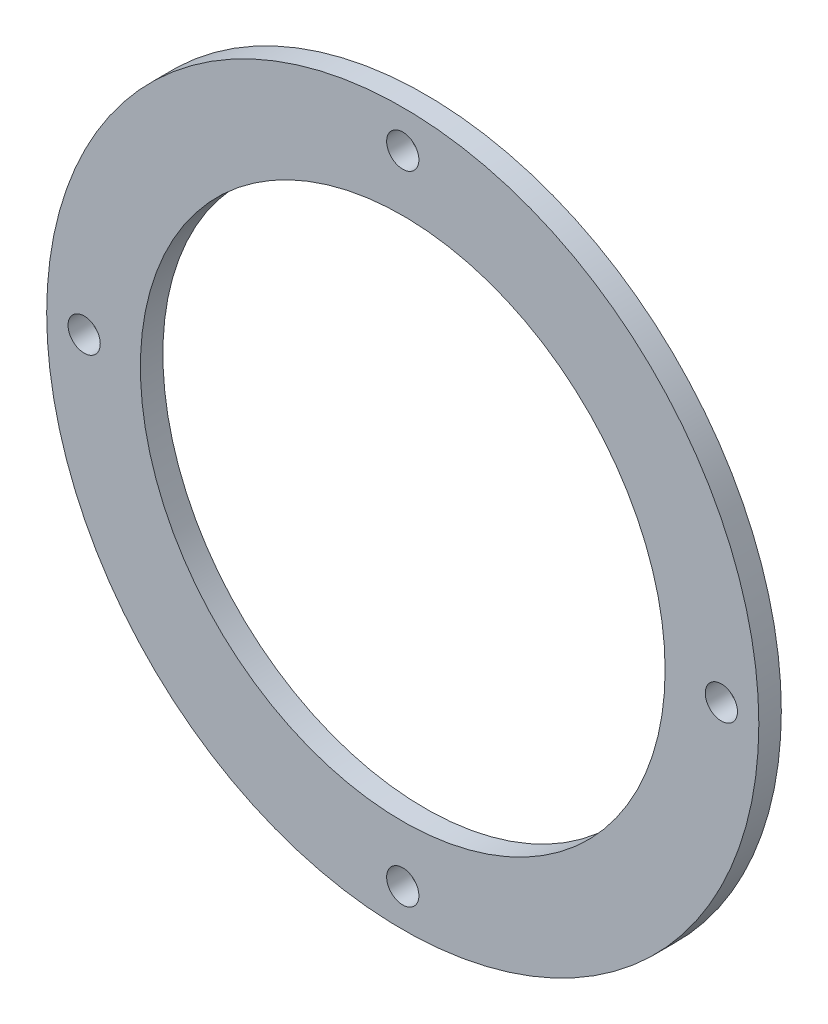
ISO-10303-21;
HEADER;
FILE_DESCRIPTION(('STEP AP214'),'2;1');
FILE_NAME('part.step','',(''),(''),'','','');
FILE_SCHEMA(('AUTOMOTIVE_DESIGN { 1 0 10303 214 1 1 1 1 }'));
ENDSEC;
DATA;
#1=APPLICATION_CONTEXT('core data for automotive mechanical design processes');
#2=APPLICATION_PROTOCOL_DEFINITION('international standard','automotive_design',2000,#1);
#3=PRODUCT_CONTEXT('',#1,'mechanical');
#4=PRODUCT('Part','Part','',(#3));
#5=PRODUCT_RELATED_PRODUCT_CATEGORY('part','',(#4));
#6=PRODUCT_DEFINITION_FORMATION('','',#4);
#7=PRODUCT_DEFINITION_CONTEXT('part definition',#1,'design');
#8=PRODUCT_DEFINITION('design','',#6,#7);
#9=PRODUCT_DEFINITION_SHAPE('','',#8);
#10=(LENGTH_UNIT() NAMED_UNIT(*) SI_UNIT(.MILLI.,.METRE.));
#11=(NAMED_UNIT(*) PLANE_ANGLE_UNIT() SI_UNIT($,.RADIAN.));
#12=(NAMED_UNIT(*) SI_UNIT($,.STERADIAN.) SOLID_ANGLE_UNIT());
#13=UNCERTAINTY_MEASURE_WITH_UNIT(LENGTH_MEASURE(1.E-05),#10,'distance_accuracy_value','');
#14=(GEOMETRIC_REPRESENTATION_CONTEXT(3) GLOBAL_UNCERTAINTY_ASSIGNED_CONTEXT((#13)) GLOBAL_UNIT_ASSIGNED_CONTEXT((#10,
#11,#12)) REPRESENTATION_CONTEXT('',''));
#15=CARTESIAN_POINT('',(0.,0.,0.));
#16=DIRECTION('',(0.,0.,1.));
#17=DIRECTION('',(1.,0.,0.));
#18=AXIS2_PLACEMENT_3D('',#15,#16,#17);
#19=CARTESIAN_POINT('',(0.,0.,3.));
#20=DIRECTION('',(0.,0.,1.));
#21=DIRECTION('',(1.,0.,0.));
#22=AXIS2_PLACEMENT_3D('',#19,#20,#21);
#23=PLANE('',#22);
#24=CARTESIAN_POINT('',(42.5,0.,3.));
#25=DIRECTION('',(0.,0.,1.));
#26=DIRECTION('',(1.,0.,0.));
#27=AXIS2_PLACEMENT_3D('',#24,#25,#26);
#28=CIRCLE('',#27,2.15);
#29=CARTESIAN_POINT('',(44.65,0.,3.));
#30=VERTEX_POINT('',#29);
#31=EDGE_CURVE('E76',#30,#30,#28,.T.);
#32=ORIENTED_EDGE('',*,*,#31,.F.);
#33=EDGE_LOOP('',(#32));
#34=FACE_BOUND('',#33,.T.);
#35=CARTESIAN_POINT('',(0.,-42.5,3.));
#36=DIRECTION('',(0.,0.,1.));
#37=DIRECTION('',(1.,0.,0.));
#38=AXIS2_PLACEMENT_3D('',#35,#36,#37);
#39=CIRCLE('',#38,2.15);
#40=CARTESIAN_POINT('',(2.15,-42.5,3.));
#41=VERTEX_POINT('',#40);
#42=EDGE_CURVE('E73',#41,#41,#39,.T.);
#43=ORIENTED_EDGE('',*,*,#42,.F.);
#44=EDGE_LOOP('',(#43));
#45=FACE_BOUND('',#44,.T.);
#46=CARTESIAN_POINT('',(-42.5,0.,3.));
#47=DIRECTION('',(0.,0.,1.));
#48=DIRECTION('',(1.,0.,0.));
#49=AXIS2_PLACEMENT_3D('',#46,#47,#48);
#50=CIRCLE('',#49,2.15000000000001);
#51=CARTESIAN_POINT('',(-40.35,0.,3.));
#52=VERTEX_POINT('',#51);
#53=EDGE_CURVE('E67',#52,#52,#50,.T.);
#54=ORIENTED_EDGE('',*,*,#53,.F.);
#55=EDGE_LOOP('',(#54));
#56=FACE_BOUND('',#55,.T.);
#57=CARTESIAN_POINT('',(0.,42.5,3.));
#58=DIRECTION('',(0.,0.,1.));
#59=DIRECTION('',(1.,0.,0.));
#60=AXIS2_PLACEMENT_3D('',#57,#58,#59);
#61=CIRCLE('',#60,2.15);
#62=CARTESIAN_POINT('',(2.14999999999999,42.5,3.));
#63=VERTEX_POINT('',#62);
#64=EDGE_CURVE('E60',#63,#63,#61,.T.);
#65=ORIENTED_EDGE('',*,*,#64,.F.);
#66=EDGE_LOOP('',(#65));
#67=FACE_BOUND('',#66,.T.);
#68=CARTESIAN_POINT('',(0.,0.,3.));
#69=DIRECTION('',(0.,0.,1.));
#70=DIRECTION('',(1.,0.,0.));
#71=AXIS2_PLACEMENT_3D('',#68,#69,#70);
#72=CIRCLE('',#71,47.5);
#73=CARTESIAN_POINT('',(47.5,0.,3.));
#74=VERTEX_POINT('',#73);
#75=EDGE_CURVE('E10',#74,#74,#72,.T.);
#76=ORIENTED_EDGE('',*,*,#75,.T.);
#77=EDGE_LOOP('',(#76));
#78=FACE_BOUND('',#77,.T.);
#79=CARTESIAN_POINT('',(0.,0.,3.));
#80=DIRECTION('',(0.,0.,1.));
#81=DIRECTION('',(1.,0.,0.));
#82=AXIS2_PLACEMENT_3D('',#79,#80,#81);
#83=CIRCLE('',#82,35.);
#84=CARTESIAN_POINT('',(35.,0.,3.));
#85=VERTEX_POINT('',#84);
#86=EDGE_CURVE('E52',#85,#85,#83,.T.);
#87=ORIENTED_EDGE('',*,*,#86,.F.);
#88=EDGE_LOOP('',(#87));
#89=FACE_BOUND('',#88,.T.);
#90=ADVANCED_FACE('F41',(#34,#45,#56,#67,#78,#89),#23,.T.);
#91=CARTESIAN_POINT('',(0.,0.,0.));
#92=DIRECTION('',(0.,0.,1.));
#93=DIRECTION('',(1.,0.,0.));
#94=AXIS2_PLACEMENT_3D('',#91,#92,#93);
#95=PLANE('',#94);
#96=CARTESIAN_POINT('',(42.5,0.,0.));
#97=DIRECTION('',(0.,0.,1.));
#98=DIRECTION('',(1.,0.,0.));
#99=AXIS2_PLACEMENT_3D('',#96,#97,#98);
#100=CIRCLE('',#99,2.15);
#101=CARTESIAN_POINT('',(44.65,0.,0.));
#102=VERTEX_POINT('',#101);
#103=EDGE_CURVE('E57',#102,#102,#100,.F.);
#104=ORIENTED_EDGE('',*,*,#103,.F.);
#105=EDGE_LOOP('',(#104));
#106=FACE_BOUND('',#105,.T.);
#107=CARTESIAN_POINT('',(0.,-42.5,0.));
#108=DIRECTION('',(0.,0.,1.));
#109=DIRECTION('',(1.,0.,0.));
#110=AXIS2_PLACEMENT_3D('',#107,#108,#109);
#111=CIRCLE('',#110,2.15);
#112=CARTESIAN_POINT('',(2.15,-42.5,0.));
#113=VERTEX_POINT('',#112);
#114=EDGE_CURVE('E70',#113,#113,#111,.F.);
#115=ORIENTED_EDGE('',*,*,#114,.F.);
#116=EDGE_LOOP('',(#115));
#117=FACE_BOUND('',#116,.T.);
#118=CARTESIAN_POINT('',(-42.5,0.,0.));
#119=DIRECTION('',(0.,0.,1.));
#120=DIRECTION('',(1.,0.,0.));
#121=AXIS2_PLACEMENT_3D('',#118,#119,#120);
#122=CIRCLE('',#121,2.15000000000001);
#123=CARTESIAN_POINT('',(-40.35,0.,0.));
#124=VERTEX_POINT('',#123);
#125=EDGE_CURVE('E63',#124,#124,#122,.F.);
#126=ORIENTED_EDGE('',*,*,#125,.F.);
#127=EDGE_LOOP('',(#126));
#128=FACE_BOUND('',#127,.T.);
#129=CARTESIAN_POINT('',(0.,42.5,0.));
#130=DIRECTION('',(0.,0.,1.));
#131=DIRECTION('',(1.,0.,0.));
#132=AXIS2_PLACEMENT_3D('',#129,#130,#131);
#133=CIRCLE('',#132,2.15);
#134=CARTESIAN_POINT('',(2.14999999999999,42.5,0.));
#135=VERTEX_POINT('',#134);
#136=EDGE_CURVE('E64',#135,#135,#133,.F.);
#137=ORIENTED_EDGE('',*,*,#136,.F.);
#138=EDGE_LOOP('',(#137));
#139=FACE_BOUND('',#138,.T.);
#140=CARTESIAN_POINT('',(0.,0.,0.));
#141=DIRECTION('',(0.,0.,1.));
#142=DIRECTION('',(1.,0.,0.));
#143=AXIS2_PLACEMENT_3D('',#140,#141,#142);
#144=CIRCLE('',#143,47.5);
#145=CARTESIAN_POINT('',(47.5,0.,0.));
#146=VERTEX_POINT('',#145);
#147=EDGE_CURVE('E45',#146,#146,#144,.T.);
#148=ORIENTED_EDGE('',*,*,#147,.F.);
#149=EDGE_LOOP('',(#148));
#150=FACE_BOUND('',#149,.T.);
#151=CARTESIAN_POINT('',(0.,0.,0.));
#152=DIRECTION('',(0.,0.,1.));
#153=DIRECTION('',(1.,0.,0.));
#154=AXIS2_PLACEMENT_3D('',#151,#152,#153);
#155=CIRCLE('',#154,35.);
#156=CARTESIAN_POINT('',(35.,0.,0.));
#157=VERTEX_POINT('',#156);
#158=EDGE_CURVE('E54',#157,#157,#155,.T.);
#159=ORIENTED_EDGE('',*,*,#158,.T.);
#160=EDGE_LOOP('',(#159));
#161=FACE_BOUND('',#160,.T.);
#162=ADVANCED_FACE('F89',(#106,#117,#128,#139,#150,#161),#95,.F.);
#163=CARTESIAN_POINT('',(0.,0.,3.));
#164=DIRECTION('',(0.,0.,-1.));
#165=DIRECTION('',(-1.,0.,0.));
#166=AXIS2_PLACEMENT_3D('',#163,#164,#165);
#167=CYLINDRICAL_SURFACE('',#166,47.5);
#168=ORIENTED_EDGE('',*,*,#75,.F.);
#169=EDGE_LOOP('',(#168));
#170=FACE_BOUND('',#169,.T.);
#171=ORIENTED_EDGE('',*,*,#147,.T.);
#172=EDGE_LOOP('',(#171));
#173=FACE_BOUND('',#172,.T.);
#174=ADVANCED_FACE('F43',(#170,#173),#167,.T.);
#175=CARTESIAN_POINT('',(0.,0.,3.));
#176=DIRECTION('',(0.,0.,-1.));
#177=DIRECTION('',(-1.,0.,0.));
#178=AXIS2_PLACEMENT_3D('',#175,#176,#177);
#179=CYLINDRICAL_SURFACE('',#178,35.);
#180=ORIENTED_EDGE('',*,*,#86,.T.);
#181=EDGE_LOOP('',(#180));
#182=FACE_BOUND('',#181,.T.);
#183=ORIENTED_EDGE('',*,*,#158,.F.);
#184=EDGE_LOOP('',(#183));
#185=FACE_BOUND('',#184,.T.);
#186=ADVANCED_FACE('F99',(#182,#185),#179,.F.);
#187=CARTESIAN_POINT('',(0.,42.5,-0.00100000000000013));
#188=DIRECTION('',(0.,0.,1.));
#189=DIRECTION('',(1.,0.,0.));
#190=AXIS2_PLACEMENT_3D('',#187,#188,#189);
#191=CYLINDRICAL_SURFACE('',#190,2.15);
#192=CARTESIAN_POINT('',(2.14999999999999,42.5,3.));
#193=CARTESIAN_POINT('',(2.14999999999999,42.5,2.96875));
#194=CARTESIAN_POINT('',(2.14999999999999,42.5,2.9375));
#195=CARTESIAN_POINT('',(2.14999999999999,42.5,2.875));
#196=CARTESIAN_POINT('',(2.14999999999999,42.5,2.84375));
#197=CARTESIAN_POINT('',(2.14999999999999,42.5,2.78125));
#198=CARTESIAN_POINT('',(2.14999999999999,42.5,2.75));
#199=CARTESIAN_POINT('',(2.14999999999999,42.5,2.6875));
#200=CARTESIAN_POINT('',(2.14999999999999,42.5,2.65625));
#201=CARTESIAN_POINT('',(2.14999999999999,42.5,2.59375));
#202=CARTESIAN_POINT('',(2.14999999999999,42.5,2.5625));
#203=CARTESIAN_POINT('',(2.14999999999999,42.5,2.5));
#204=CARTESIAN_POINT('',(2.14999999999999,42.5,2.46875));
#205=CARTESIAN_POINT('',(2.14999999999999,42.5,2.40625));
#206=CARTESIAN_POINT('',(2.14999999999999,42.5,2.375));
#207=CARTESIAN_POINT('',(2.14999999999999,42.5,2.3125));
#208=CARTESIAN_POINT('',(2.14999999999999,42.5,2.28125));
#209=CARTESIAN_POINT('',(2.14999999999999,42.5,2.21875));
#210=CARTESIAN_POINT('',(2.14999999999999,42.5,2.1875));
#211=CARTESIAN_POINT('',(2.14999999999999,42.5,2.125));
#212=CARTESIAN_POINT('',(2.14999999999999,42.5,2.09375));
#213=CARTESIAN_POINT('',(2.14999999999999,42.5,2.03125));
#214=CARTESIAN_POINT('',(2.14999999999999,42.5,2.));
#215=CARTESIAN_POINT('',(2.14999999999999,42.5,1.9375));
#216=CARTESIAN_POINT('',(2.14999999999999,42.5,1.90625));
#217=CARTESIAN_POINT('',(2.14999999999999,42.5,1.84375));
#218=CARTESIAN_POINT('',(2.14999999999999,42.5,1.8125));
#219=CARTESIAN_POINT('',(2.14999999999999,42.5,1.75));
#220=CARTESIAN_POINT('',(2.14999999999999,42.5,1.71875));
#221=CARTESIAN_POINT('',(2.14999999999999,42.5,1.65625));
#222=CARTESIAN_POINT('',(2.14999999999999,42.5,1.625));
#223=CARTESIAN_POINT('',(2.14999999999999,42.5,1.5625));
#224=CARTESIAN_POINT('',(2.14999999999999,42.5,1.53125));
#225=CARTESIAN_POINT('',(2.14999999999999,42.5,1.46875));
#226=CARTESIAN_POINT('',(2.14999999999999,42.5,1.4375));
#227=CARTESIAN_POINT('',(2.14999999999999,42.5,1.375));
#228=CARTESIAN_POINT('',(2.14999999999999,42.5,1.34375));
#229=CARTESIAN_POINT('',(2.14999999999999,42.5,1.28125));
#230=CARTESIAN_POINT('',(2.14999999999999,42.5,1.25));
#231=CARTESIAN_POINT('',(2.14999999999999,42.5,1.1875));
#232=CARTESIAN_POINT('',(2.14999999999999,42.5,1.15625));
#233=CARTESIAN_POINT('',(2.14999999999999,42.5,1.09375));
#234=CARTESIAN_POINT('',(2.14999999999999,42.5,1.0625));
#235=CARTESIAN_POINT('',(2.14999999999999,42.5,1.));
#236=CARTESIAN_POINT('',(2.14999999999999,42.5,0.96875));
#237=CARTESIAN_POINT('',(2.14999999999999,42.5,0.90625));
#238=CARTESIAN_POINT('',(2.14999999999999,42.5,0.875));
#239=CARTESIAN_POINT('',(2.14999999999999,42.5,0.8125));
#240=CARTESIAN_POINT('',(2.14999999999999,42.5,0.78125));
#241=CARTESIAN_POINT('',(2.14999999999999,42.5,0.71875));
#242=CARTESIAN_POINT('',(2.14999999999999,42.5,0.6875));
#243=CARTESIAN_POINT('',(2.14999999999999,42.5,0.625));
#244=CARTESIAN_POINT('',(2.14999999999999,42.5,0.59375));
#245=CARTESIAN_POINT('',(2.14999999999999,42.5,0.53125));
#246=CARTESIAN_POINT('',(2.14999999999999,42.5,0.5));
#247=CARTESIAN_POINT('',(2.14999999999999,42.5,0.4375));
#248=CARTESIAN_POINT('',(2.14999999999999,42.5,0.40625));
#249=CARTESIAN_POINT('',(2.14999999999999,42.5,0.34375));
#250=CARTESIAN_POINT('',(2.14999999999999,42.5,0.3125));
#251=CARTESIAN_POINT('',(2.14999999999999,42.5,0.25));
#252=CARTESIAN_POINT('',(2.14999999999999,42.5,0.21875));
#253=CARTESIAN_POINT('',(2.14999999999999,42.5,0.15625));
#254=CARTESIAN_POINT('',(2.14999999999999,42.5,0.125));
#255=CARTESIAN_POINT('',(2.14999999999999,42.5,0.0625000000000001));
#256=CARTESIAN_POINT('',(2.14999999999999,42.5,0.0312500000000001));
#257=CARTESIAN_POINT('',(2.14999999999999,42.5,0.));
#258=B_SPLINE_CURVE_WITH_KNOTS('',3,(#192,#193,#194,#195,#196,#197,#198,#199,#200,#201,#202,
#203,#204,#205,#206,#207,#208,#209,#210,#211,#212,#213,#214,#215,#216,#217,#218,#219,#220,#221,
#222,#223,#224,#225,#226,#227,#228,#229,#230,#231,#232,#233,#234,#235,#236,#237,#238,#239,#240,
#241,#242,#243,#244,#245,#246,#247,#248,#249,#250,#251,#252,#253,#254,#255,#256,#257),
.UNSPECIFIED.,.F.,.F.,(4,2,2,2,2,2,2,2,2,2,2,2,2,2,2,2,2,2,2,2,2,2,2,2,2,2,2,2,2,2,2,2,4),(0.,
0.0937500000000001,0.1875,0.28125,0.375,0.46875,0.5625,0.65625,0.75,0.84375,0.9375,1.03125,
1.125,1.21875,1.3125,1.40625,1.5,1.59375,1.6875,1.78125,1.875,1.96875,2.0625,2.15625,2.25,
2.34375,2.4375,2.53125,2.625,2.71875,2.8125,2.90625,3.),.UNSPECIFIED.);
#259=EDGE_CURVE('BSEAM102',#63,#135,#258,.T.);
#260=ORIENTED_EDGE('',*,*,#64,.T.);
#261=ORIENTED_EDGE('',*,*,#136,.T.);
#262=ORIENTED_EDGE('',*,*,#259,.T.);
#263=ORIENTED_EDGE('',*,*,#259,.F.);
#264=EDGE_LOOP('',(#260,#262,#261,#263));
#265=FACE_BOUND('',#264,.T.);
#266=ADVANCED_FACE('F102',(#265),#191,.F.);
#267=CARTESIAN_POINT('',(-42.5,0.,-0.00100000000000013));
#268=DIRECTION('',(0.,0.,1.));
#269=DIRECTION('',(1.,0.,0.));
#270=AXIS2_PLACEMENT_3D('',#267,#268,#269);
#271=CYLINDRICAL_SURFACE('',#270,2.15000000000001);
#272=CARTESIAN_POINT('',(-40.35,0.,3.));
#273=CARTESIAN_POINT('',(-40.35,0.,2.96875));
#274=CARTESIAN_POINT('',(-40.35,0.,2.9375));
#275=CARTESIAN_POINT('',(-40.35,0.,2.875));
#276=CARTESIAN_POINT('',(-40.35,0.,2.84375));
#277=CARTESIAN_POINT('',(-40.35,0.,2.78125));
#278=CARTESIAN_POINT('',(-40.35,0.,2.75));
#279=CARTESIAN_POINT('',(-40.35,0.,2.6875));
#280=CARTESIAN_POINT('',(-40.35,0.,2.65625));
#281=CARTESIAN_POINT('',(-40.35,0.,2.59375));
#282=CARTESIAN_POINT('',(-40.35,0.,2.5625));
#283=CARTESIAN_POINT('',(-40.35,0.,2.5));
#284=CARTESIAN_POINT('',(-40.35,0.,2.46875));
#285=CARTESIAN_POINT('',(-40.35,0.,2.40625));
#286=CARTESIAN_POINT('',(-40.35,0.,2.375));
#287=CARTESIAN_POINT('',(-40.35,0.,2.3125));
#288=CARTESIAN_POINT('',(-40.35,0.,2.28125));
#289=CARTESIAN_POINT('',(-40.35,0.,2.21875));
#290=CARTESIAN_POINT('',(-40.35,0.,2.1875));
#291=CARTESIAN_POINT('',(-40.35,0.,2.125));
#292=CARTESIAN_POINT('',(-40.35,0.,2.09375));
#293=CARTESIAN_POINT('',(-40.35,0.,2.03125));
#294=CARTESIAN_POINT('',(-40.35,0.,2.));
#295=CARTESIAN_POINT('',(-40.35,0.,1.9375));
#296=CARTESIAN_POINT('',(-40.35,0.,1.90625));
#297=CARTESIAN_POINT('',(-40.35,0.,1.84375));
#298=CARTESIAN_POINT('',(-40.35,0.,1.8125));
#299=CARTESIAN_POINT('',(-40.35,0.,1.75));
#300=CARTESIAN_POINT('',(-40.35,0.,1.71875));
#301=CARTESIAN_POINT('',(-40.35,0.,1.65625));
#302=CARTESIAN_POINT('',(-40.35,0.,1.625));
#303=CARTESIAN_POINT('',(-40.35,0.,1.5625));
#304=CARTESIAN_POINT('',(-40.35,0.,1.53125));
#305=CARTESIAN_POINT('',(-40.35,0.,1.46875));
#306=CARTESIAN_POINT('',(-40.35,0.,1.4375));
#307=CARTESIAN_POINT('',(-40.35,0.,1.375));
#308=CARTESIAN_POINT('',(-40.35,0.,1.34375));
#309=CARTESIAN_POINT('',(-40.35,0.,1.28125));
#310=CARTESIAN_POINT('',(-40.35,0.,1.25));
#311=CARTESIAN_POINT('',(-40.35,0.,1.1875));
#312=CARTESIAN_POINT('',(-40.35,0.,1.15625));
#313=CARTESIAN_POINT('',(-40.35,0.,1.09375));
#314=CARTESIAN_POINT('',(-40.35,0.,1.0625));
#315=CARTESIAN_POINT('',(-40.35,0.,1.));
#316=CARTESIAN_POINT('',(-40.35,0.,0.96875));
#317=CARTESIAN_POINT('',(-40.35,0.,0.90625));
#318=CARTESIAN_POINT('',(-40.35,0.,0.875));
#319=CARTESIAN_POINT('',(-40.35,0.,0.8125));
#320=CARTESIAN_POINT('',(-40.35,0.,0.78125));
#321=CARTESIAN_POINT('',(-40.35,0.,0.71875));
#322=CARTESIAN_POINT('',(-40.35,0.,0.6875));
#323=CARTESIAN_POINT('',(-40.35,0.,0.625));
#324=CARTESIAN_POINT('',(-40.35,0.,0.59375));
#325=CARTESIAN_POINT('',(-40.35,0.,0.53125));
#326=CARTESIAN_POINT('',(-40.35,0.,0.5));
#327=CARTESIAN_POINT('',(-40.35,0.,0.4375));
#328=CARTESIAN_POINT('',(-40.35,0.,0.40625));
#329=CARTESIAN_POINT('',(-40.35,0.,0.34375));
#330=CARTESIAN_POINT('',(-40.35,0.,0.3125));
#331=CARTESIAN_POINT('',(-40.35,0.,0.25));
#332=CARTESIAN_POINT('',(-40.35,0.,0.21875));
#333=CARTESIAN_POINT('',(-40.35,0.,0.15625));
#334=CARTESIAN_POINT('',(-40.35,0.,0.125));
#335=CARTESIAN_POINT('',(-40.35,0.,0.0625000000000001));
#336=CARTESIAN_POINT('',(-40.35,0.,0.0312500000000001));
#337=CARTESIAN_POINT('',(-40.35,0.,0.));
#338=B_SPLINE_CURVE_WITH_KNOTS('',3,(#272,#273,#274,#275,#276,#277,#278,#279,#280,#281,#282,
#283,#284,#285,#286,#287,#288,#289,#290,#291,#292,#293,#294,#295,#296,#297,#298,#299,#300,#301,
#302,#303,#304,#305,#306,#307,#308,#309,#310,#311,#312,#313,#314,#315,#316,#317,#318,#319,#320,
#321,#322,#323,#324,#325,#326,#327,#328,#329,#330,#331,#332,#333,#334,#335,#336,#337),
.UNSPECIFIED.,.F.,.F.,(4,2,2,2,2,2,2,2,2,2,2,2,2,2,2,2,2,2,2,2,2,2,2,2,2,2,2,2,2,2,2,2,4),(0.,
0.0937500000000001,0.1875,0.28125,0.375,0.46875,0.5625,0.65625,0.75,0.84375,0.9375,1.03125,
1.125,1.21875,1.3125,1.40625,1.5,1.59375,1.6875,1.78125,1.875,1.96875,2.0625,2.15625,2.25,
2.34375,2.4375,2.53125,2.625,2.71875,2.8125,2.90625,3.),.UNSPECIFIED.);
#339=EDGE_CURVE('BSEAM117',#52,#124,#338,.T.);
#340=ORIENTED_EDGE('',*,*,#53,.T.);
#341=ORIENTED_EDGE('',*,*,#125,.T.);
#342=ORIENTED_EDGE('',*,*,#339,.T.);
#343=ORIENTED_EDGE('',*,*,#339,.F.);
#344=EDGE_LOOP('',(#340,#342,#341,#343));
#345=FACE_BOUND('',#344,.T.);
#346=ADVANCED_FACE('F117',(#345),#271,.F.);
#347=CARTESIAN_POINT('',(0.,-42.5,-0.00100000000000013));
#348=DIRECTION('',(0.,0.,1.));
#349=DIRECTION('',(1.,0.,0.));
#350=AXIS2_PLACEMENT_3D('',#347,#348,#349);
#351=CYLINDRICAL_SURFACE('',#350,2.15);
#352=CARTESIAN_POINT('',(2.15,-42.5,3.));
#353=CARTESIAN_POINT('',(2.15,-42.5,2.96875));
#354=CARTESIAN_POINT('',(2.15,-42.5,2.9375));
#355=CARTESIAN_POINT('',(2.15,-42.5,2.875));
#356=CARTESIAN_POINT('',(2.15,-42.5,2.84375));
#357=CARTESIAN_POINT('',(2.15,-42.5,2.78125));
#358=CARTESIAN_POINT('',(2.15,-42.5,2.75));
#359=CARTESIAN_POINT('',(2.15,-42.5,2.6875));
#360=CARTESIAN_POINT('',(2.15,-42.5,2.65625));
#361=CARTESIAN_POINT('',(2.15,-42.5,2.59375));
#362=CARTESIAN_POINT('',(2.15,-42.5,2.5625));
#363=CARTESIAN_POINT('',(2.15,-42.5,2.5));
#364=CARTESIAN_POINT('',(2.15,-42.5,2.46875));
#365=CARTESIAN_POINT('',(2.15,-42.5,2.40625));
#366=CARTESIAN_POINT('',(2.15,-42.5,2.375));
#367=CARTESIAN_POINT('',(2.15,-42.5,2.3125));
#368=CARTESIAN_POINT('',(2.15,-42.5,2.28125));
#369=CARTESIAN_POINT('',(2.15,-42.5,2.21875));
#370=CARTESIAN_POINT('',(2.15,-42.5,2.1875));
#371=CARTESIAN_POINT('',(2.15,-42.5,2.125));
#372=CARTESIAN_POINT('',(2.15,-42.5,2.09375));
#373=CARTESIAN_POINT('',(2.15,-42.5,2.03125));
#374=CARTESIAN_POINT('',(2.15,-42.5,2.));
#375=CARTESIAN_POINT('',(2.15,-42.5,1.9375));
#376=CARTESIAN_POINT('',(2.15,-42.5,1.90625));
#377=CARTESIAN_POINT('',(2.15,-42.5,1.84375));
#378=CARTESIAN_POINT('',(2.15,-42.5,1.8125));
#379=CARTESIAN_POINT('',(2.15,-42.5,1.75));
#380=CARTESIAN_POINT('',(2.15,-42.5,1.71875));
#381=CARTESIAN_POINT('',(2.15,-42.5,1.65625));
#382=CARTESIAN_POINT('',(2.15,-42.5,1.625));
#383=CARTESIAN_POINT('',(2.15,-42.5,1.5625));
#384=CARTESIAN_POINT('',(2.15,-42.5,1.53125));
#385=CARTESIAN_POINT('',(2.15,-42.5,1.46875));
#386=CARTESIAN_POINT('',(2.15,-42.5,1.4375));
#387=CARTESIAN_POINT('',(2.15,-42.5,1.375));
#388=CARTESIAN_POINT('',(2.15,-42.5,1.34375));
#389=CARTESIAN_POINT('',(2.15,-42.5,1.28125));
#390=CARTESIAN_POINT('',(2.15,-42.5,1.25));
#391=CARTESIAN_POINT('',(2.15,-42.5,1.1875));
#392=CARTESIAN_POINT('',(2.15,-42.5,1.15625));
#393=CARTESIAN_POINT('',(2.15,-42.5,1.09375));
#394=CARTESIAN_POINT('',(2.15,-42.5,1.0625));
#395=CARTESIAN_POINT('',(2.15,-42.5,1.));
#396=CARTESIAN_POINT('',(2.15,-42.5,0.96875));
#397=CARTESIAN_POINT('',(2.15,-42.5,0.90625));
#398=CARTESIAN_POINT('',(2.15,-42.5,0.875));
#399=CARTESIAN_POINT('',(2.15,-42.5,0.8125));
#400=CARTESIAN_POINT('',(2.15,-42.5,0.78125));
#401=CARTESIAN_POINT('',(2.15,-42.5,0.71875));
#402=CARTESIAN_POINT('',(2.15,-42.5,0.6875));
#403=CARTESIAN_POINT('',(2.15,-42.5,0.625));
#404=CARTESIAN_POINT('',(2.15,-42.5,0.59375));
#405=CARTESIAN_POINT('',(2.15,-42.5,0.53125));
#406=CARTESIAN_POINT('',(2.15,-42.5,0.5));
#407=CARTESIAN_POINT('',(2.15,-42.5,0.4375));
#408=CARTESIAN_POINT('',(2.15,-42.5,0.40625));
#409=CARTESIAN_POINT('',(2.15,-42.5,0.34375));
#410=CARTESIAN_POINT('',(2.15,-42.5,0.3125));
#411=CARTESIAN_POINT('',(2.15,-42.5,0.25));
#412=CARTESIAN_POINT('',(2.15,-42.5,0.21875));
#413=CARTESIAN_POINT('',(2.15,-42.5,0.15625));
#414=CARTESIAN_POINT('',(2.15,-42.5,0.125));
#415=CARTESIAN_POINT('',(2.15,-42.5,0.0625000000000001));
#416=CARTESIAN_POINT('',(2.15,-42.5,0.0312500000000001));
#417=CARTESIAN_POINT('',(2.15,-42.5,0.));
#418=B_SPLINE_CURVE_WITH_KNOTS('',3,(#352,#353,#354,#355,#356,#357,#358,#359,#360,#361,#362,
#363,#364,#365,#366,#367,#368,#369,#370,#371,#372,#373,#374,#375,#376,#377,#378,#379,#380,#381,
#382,#383,#384,#385,#386,#387,#388,#389,#390,#391,#392,#393,#394,#395,#396,#397,#398,#399,#400,
#401,#402,#403,#404,#405,#406,#407,#408,#409,#410,#411,#412,#413,#414,#415,#416,#417),
.UNSPECIFIED.,.F.,.F.,(4,2,2,2,2,2,2,2,2,2,2,2,2,2,2,2,2,2,2,2,2,2,2,2,2,2,2,2,2,2,2,2,4),(0.,
0.0937500000000001,0.1875,0.28125,0.375,0.46875,0.5625,0.65625,0.75,0.84375,0.9375,1.03125,
1.125,1.21875,1.3125,1.40625,1.5,1.59375,1.6875,1.78125,1.875,1.96875,2.0625,2.15625,2.25,
2.34375,2.4375,2.53125,2.625,2.71875,2.8125,2.90625,3.),.UNSPECIFIED.);
#419=EDGE_CURVE('BSEAM121',#41,#113,#418,.T.);
#420=ORIENTED_EDGE('',*,*,#42,.T.);
#421=ORIENTED_EDGE('',*,*,#114,.T.);
#422=ORIENTED_EDGE('',*,*,#419,.T.);
#423=ORIENTED_EDGE('',*,*,#419,.F.);
#424=EDGE_LOOP('',(#420,#422,#421,#423));
#425=FACE_BOUND('',#424,.T.);
#426=ADVANCED_FACE('F121',(#425),#351,.F.);
#427=CARTESIAN_POINT('',(42.5,0.,-0.00100000000000013));
#428=DIRECTION('',(0.,0.,1.));
#429=DIRECTION('',(1.,0.,0.));
#430=AXIS2_PLACEMENT_3D('',#427,#428,#429);
#431=CYLINDRICAL_SURFACE('',#430,2.15);
#432=CARTESIAN_POINT('',(44.65,0.,3.));
#433=CARTESIAN_POINT('',(44.65,0.,2.96875));
#434=CARTESIAN_POINT('',(44.65,0.,2.9375));
#435=CARTESIAN_POINT('',(44.65,0.,2.875));
#436=CARTESIAN_POINT('',(44.65,0.,2.84375));
#437=CARTESIAN_POINT('',(44.65,0.,2.78125));
#438=CARTESIAN_POINT('',(44.65,0.,2.75));
#439=CARTESIAN_POINT('',(44.65,0.,2.6875));
#440=CARTESIAN_POINT('',(44.65,0.,2.65625));
#441=CARTESIAN_POINT('',(44.65,0.,2.59375));
#442=CARTESIAN_POINT('',(44.65,0.,2.5625));
#443=CARTESIAN_POINT('',(44.65,0.,2.5));
#444=CARTESIAN_POINT('',(44.65,0.,2.46875));
#445=CARTESIAN_POINT('',(44.65,0.,2.40625));
#446=CARTESIAN_POINT('',(44.65,0.,2.375));
#447=CARTESIAN_POINT('',(44.65,0.,2.3125));
#448=CARTESIAN_POINT('',(44.65,0.,2.28125));
#449=CARTESIAN_POINT('',(44.65,0.,2.21875));
#450=CARTESIAN_POINT('',(44.65,0.,2.1875));
#451=CARTESIAN_POINT('',(44.65,0.,2.125));
#452=CARTESIAN_POINT('',(44.65,0.,2.09375));
#453=CARTESIAN_POINT('',(44.65,0.,2.03125));
#454=CARTESIAN_POINT('',(44.65,0.,2.));
#455=CARTESIAN_POINT('',(44.65,0.,1.9375));
#456=CARTESIAN_POINT('',(44.65,0.,1.90625));
#457=CARTESIAN_POINT('',(44.65,0.,1.84375));
#458=CARTESIAN_POINT('',(44.65,0.,1.8125));
#459=CARTESIAN_POINT('',(44.65,0.,1.75));
#460=CARTESIAN_POINT('',(44.65,0.,1.71875));
#461=CARTESIAN_POINT('',(44.65,0.,1.65625));
#462=CARTESIAN_POINT('',(44.65,0.,1.625));
#463=CARTESIAN_POINT('',(44.65,0.,1.5625));
#464=CARTESIAN_POINT('',(44.65,0.,1.53125));
#465=CARTESIAN_POINT('',(44.65,0.,1.46875));
#466=CARTESIAN_POINT('',(44.65,0.,1.4375));
#467=CARTESIAN_POINT('',(44.65,0.,1.375));
#468=CARTESIAN_POINT('',(44.65,0.,1.34375));
#469=CARTESIAN_POINT('',(44.65,0.,1.28125));
#470=CARTESIAN_POINT('',(44.65,0.,1.25));
#471=CARTESIAN_POINT('',(44.65,0.,1.1875));
#472=CARTESIAN_POINT('',(44.65,0.,1.15625));
#473=CARTESIAN_POINT('',(44.65,0.,1.09375));
#474=CARTESIAN_POINT('',(44.65,0.,1.0625));
#475=CARTESIAN_POINT('',(44.65,0.,1.));
#476=CARTESIAN_POINT('',(44.65,0.,0.96875));
#477=CARTESIAN_POINT('',(44.65,0.,0.90625));
#478=CARTESIAN_POINT('',(44.65,0.,0.875));
#479=CARTESIAN_POINT('',(44.65,0.,0.8125));
#480=CARTESIAN_POINT('',(44.65,0.,0.78125));
#481=CARTESIAN_POINT('',(44.65,0.,0.71875));
#482=CARTESIAN_POINT('',(44.65,0.,0.6875));
#483=CARTESIAN_POINT('',(44.65,0.,0.625));
#484=CARTESIAN_POINT('',(44.65,0.,0.59375));
#485=CARTESIAN_POINT('',(44.65,0.,0.53125));
#486=CARTESIAN_POINT('',(44.65,0.,0.5));
#487=CARTESIAN_POINT('',(44.65,0.,0.4375));
#488=CARTESIAN_POINT('',(44.65,0.,0.40625));
#489=CARTESIAN_POINT('',(44.65,0.,0.34375));
#490=CARTESIAN_POINT('',(44.65,0.,0.3125));
#491=CARTESIAN_POINT('',(44.65,0.,0.25));
#492=CARTESIAN_POINT('',(44.65,0.,0.21875));
#493=CARTESIAN_POINT('',(44.65,0.,0.15625));
#494=CARTESIAN_POINT('',(44.65,0.,0.125));
#495=CARTESIAN_POINT('',(44.65,0.,0.0625000000000001));
#496=CARTESIAN_POINT('',(44.65,0.,0.0312500000000001));
#497=CARTESIAN_POINT('',(44.65,0.,0.));
#498=B_SPLINE_CURVE_WITH_KNOTS('',3,(#432,#433,#434,#435,#436,#437,#438,#439,#440,#441,#442,
#443,#444,#445,#446,#447,#448,#449,#450,#451,#452,#453,#454,#455,#456,#457,#458,#459,#460,#461,
#462,#463,#464,#465,#466,#467,#468,#469,#470,#471,#472,#473,#474,#475,#476,#477,#478,#479,#480,
#481,#482,#483,#484,#485,#486,#487,#488,#489,#490,#491,#492,#493,#494,#495,#496,#497),
.UNSPECIFIED.,.F.,.F.,(4,2,2,2,2,2,2,2,2,2,2,2,2,2,2,2,2,2,2,2,2,2,2,2,2,2,2,2,2,2,2,2,4),(0.,
0.0937500000000001,0.1875,0.28125,0.375,0.46875,0.5625,0.65625,0.75,0.84375,0.9375,1.03125,
1.125,1.21875,1.3125,1.40625,1.5,1.59375,1.6875,1.78125,1.875,1.96875,2.0625,2.15625,2.25,
2.34375,2.4375,2.53125,2.625,2.71875,2.8125,2.90625,3.),.UNSPECIFIED.);
#499=EDGE_CURVE('BSEAM84',#30,#102,#498,.T.);
#500=ORIENTED_EDGE('',*,*,#31,.T.);
#501=ORIENTED_EDGE('',*,*,#103,.T.);
#502=ORIENTED_EDGE('',*,*,#499,.T.);
#503=ORIENTED_EDGE('',*,*,#499,.F.);
#504=EDGE_LOOP('',(#500,#502,#501,#503));
#505=FACE_BOUND('',#504,.T.);
#506=ADVANCED_FACE('F84',(#505),#431,.F.);
#507=CLOSED_SHELL('',(#90,#162,#174,#186,#266,#346,#426,#506));
#508=MANIFOLD_SOLID_BREP('B2',#507);
#509=ADVANCED_BREP_SHAPE_REPRESENTATION('',(#18,#508),#14);
#510=SHAPE_DEFINITION_REPRESENTATION(#9,#509);
ENDSEC;
END-ISO-10303-21;
